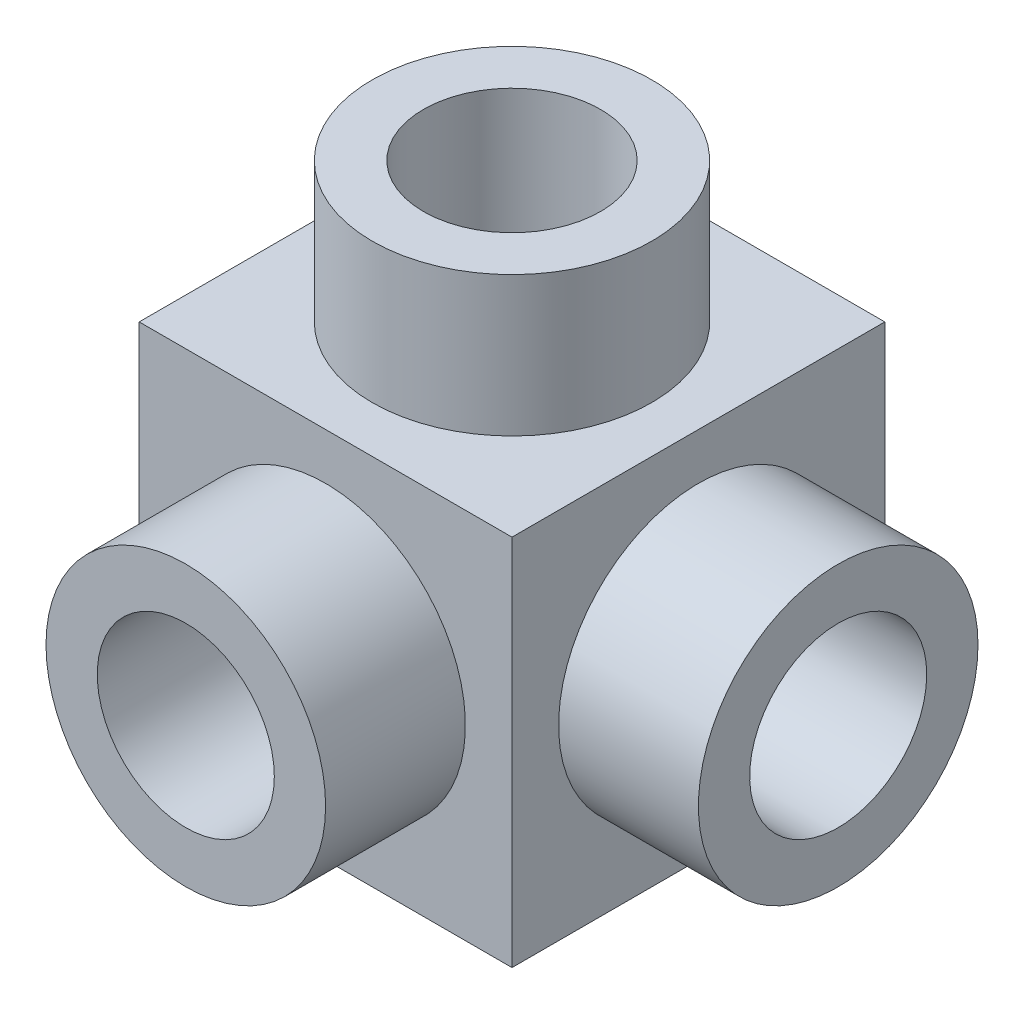
ISO-10303-21;
HEADER;
FILE_DESCRIPTION(('STEP AP214'),'2;1');
FILE_NAME('part.step','',(''),(''),'','','');
FILE_SCHEMA(('AUTOMOTIVE_DESIGN { 1 0 10303 214 1 1 1 1 }'));
ENDSEC;
DATA;
#1=APPLICATION_CONTEXT('core data for automotive mechanical design processes');
#2=APPLICATION_PROTOCOL_DEFINITION('international standard','automotive_design',2000,#1);
#3=PRODUCT_CONTEXT('',#1,'mechanical');
#4=PRODUCT('Part','Part','',(#3));
#5=PRODUCT_RELATED_PRODUCT_CATEGORY('part','',(#4));
#6=PRODUCT_DEFINITION_FORMATION('','',#4);
#7=PRODUCT_DEFINITION_CONTEXT('part definition',#1,'design');
#8=PRODUCT_DEFINITION('design','',#6,#7);
#9=PRODUCT_DEFINITION_SHAPE('','',#8);
#10=(LENGTH_UNIT() NAMED_UNIT(*) SI_UNIT(.MILLI.,.METRE.));
#11=(NAMED_UNIT(*) PLANE_ANGLE_UNIT() SI_UNIT($,.RADIAN.));
#12=(NAMED_UNIT(*) SI_UNIT($,.STERADIAN.) SOLID_ANGLE_UNIT());
#13=UNCERTAINTY_MEASURE_WITH_UNIT(LENGTH_MEASURE(1.E-05),#10,'distance_accuracy_value','');
#14=(GEOMETRIC_REPRESENTATION_CONTEXT(3) GLOBAL_UNCERTAINTY_ASSIGNED_CONTEXT((#13)) GLOBAL_UNIT_ASSIGNED_CONTEXT((#10,
#11,#12)) REPRESENTATION_CONTEXT('',''));
#15=CARTESIAN_POINT('',(0.,0.,0.));
#16=DIRECTION('',(0.,0.,1.));
#17=DIRECTION('',(1.,0.,0.));
#18=AXIS2_PLACEMENT_3D('',#15,#16,#17);
#19=CARTESIAN_POINT('',(0.,0.,30.));
#20=DIRECTION('',(0.,0.,1.));
#21=DIRECTION('',(1.,0.,0.));
#22=AXIS2_PLACEMENT_3D('',#19,#20,#21);
#23=PLANE('',#22);
#24=CARTESIAN_POINT('',(0.,0.,30.));
#25=DIRECTION('',(0.,0.,1.));
#26=DIRECTION('',(1.,0.,0.));
#27=AXIS2_PLACEMENT_3D('',#24,#25,#26);
#28=CIRCLE('',#27,30.);
#29=CARTESIAN_POINT('',(30.,0.,30.));
#30=VERTEX_POINT('',#29);
#31=EDGE_CURVE('E125',#30,#30,#28,.T.);
#32=ORIENTED_EDGE('',*,*,#31,.T.);
#33=EDGE_LOOP('',(#32));
#34=FACE_BOUND('',#33,.T.);
#35=CARTESIAN_POINT('',(0.,0.,30.));
#36=DIRECTION('',(0.,0.,1.));
#37=DIRECTION('',(1.,0.,0.));
#38=AXIS2_PLACEMENT_3D('',#35,#36,#37);
#39=CIRCLE('',#38,19.);
#40=CARTESIAN_POINT('',(19.,0.,30.));
#41=VERTEX_POINT('',#40);
#42=EDGE_CURVE('E122',#41,#41,#39,.T.);
#43=ORIENTED_EDGE('',*,*,#42,.F.);
#44=EDGE_LOOP('',(#43));
#45=FACE_BOUND('',#44,.T.);
#46=ADVANCED_FACE('F37',(#34,#45),#23,.T.);
#47=CARTESIAN_POINT('',(0.,0.,30.));
#48=DIRECTION('',(0.,0.,-1.));
#49=DIRECTION('',(-1.,0.,0.));
#50=AXIS2_PLACEMENT_3D('',#47,#48,#49);
#51=CYLINDRICAL_SURFACE('',#50,30.);
#52=ORIENTED_EDGE('',*,*,#31,.F.);
#53=EDGE_LOOP('',(#52));
#54=FACE_BOUND('',#53,.T.);
#55=CARTESIAN_POINT('',(0.,0.,0.));
#56=DIRECTION('',(0.,0.,-1.));
#57=DIRECTION('',(-1.,0.,0.));
#58=AXIS2_PLACEMENT_3D('',#55,#56,#57);
#59=CIRCLE('',#58,30.);
#60=CARTESIAN_POINT('',(-30.,0.,0.));
#61=VERTEX_POINT('',#60);
#62=EDGE_CURVE('E116',#61,#61,#59,.T.);
#63=ORIENTED_EDGE('',*,*,#62,.F.);
#64=EDGE_LOOP('',(#63));
#65=FACE_BOUND('',#64,.T.);
#66=ADVANCED_FACE('F39',(#54,#65),#51,.T.);
#67=CARTESIAN_POINT('',(0.,0.,30.));
#68=DIRECTION('',(0.,0.,-1.));
#69=DIRECTION('',(-1.,0.,0.));
#70=AXIS2_PLACEMENT_3D('',#67,#68,#69);
#71=CYLINDRICAL_SURFACE('',#70,19.);
#72=ORIENTED_EDGE('',*,*,#42,.T.);
#73=EDGE_LOOP('',(#72));
#74=FACE_BOUND('',#73,.T.);
#75=CARTESIAN_POINT('',(0.,0.,0.));
#76=DIRECTION('',(0.,0.,1.));
#77=DIRECTION('',(1.,0.,0.));
#78=AXIS2_PLACEMENT_3D('',#75,#76,#77);
#79=CIRCLE('',#78,19.);
#80=CARTESIAN_POINT('',(19.,0.,0.));
#81=VERTEX_POINT('',#80);
#82=EDGE_CURVE('E121',#81,#81,#79,.T.);
#83=ORIENTED_EDGE('',*,*,#82,.F.);
#84=EDGE_LOOP('',(#83));
#85=FACE_BOUND('',#84,.T.);
#86=ADVANCED_FACE('F158',(#74,#85),#71,.F.);
#87=CARTESIAN_POINT('',(0.,0.,0.));
#88=DIRECTION('',(0.,0.,-1.));
#89=DIRECTION('',(-1.,0.,0.));
#90=AXIS2_PLACEMENT_3D('',#87,#88,#89);
#91=PLANE('',#90);
#92=ORIENTED_EDGE('',*,*,#82,.T.);
#93=EDGE_LOOP('',(#92));
#94=FACE_BOUND('',#93,.T.);
#95=ADVANCED_FACE('F164',(#94),#91,.F.);
#96=CARTESIAN_POINT('',(-40.,40.,-80.));
#97=DIRECTION('',(-1.,0.,0.));
#98=DIRECTION('',(0.,0.,1.));
#99=AXIS2_PLACEMENT_3D('',#96,#97,#98);
#100=PLANE('',#99);
#101=DIRECTION('',(0.,-1.,0.));
#102=VECTOR('',#101,1.);
#103=CARTESIAN_POINT('',(-40.,40.,0.));
#104=LINE('',#103,#102);
#105=CARTESIAN_POINT('',(-40.,40.,0.));
#106=VERTEX_POINT('',#105);
#107=CARTESIAN_POINT('',(-40.,-40.,0.));
#108=VERTEX_POINT('',#107);
#109=EDGE_CURVE('E106',#106,#108,#104,.T.);
#110=ORIENTED_EDGE('',*,*,#109,.F.);
#111=DIRECTION('',(0.,0.,1.));
#112=VECTOR('',#111,1.);
#113=CARTESIAN_POINT('',(-40.,40.,-80.));
#114=LINE('',#113,#112);
#115=CARTESIAN_POINT('',(-40.,40.,-80.));
#116=VERTEX_POINT('',#115);
#117=EDGE_CURVE('E54',#116,#106,#114,.T.);
#118=ORIENTED_EDGE('',*,*,#117,.F.);
#119=DIRECTION('',(0.,-1.,0.));
#120=VECTOR('',#119,1.);
#121=CARTESIAN_POINT('',(-40.,40.,-80.));
#122=LINE('',#121,#120);
#123=CARTESIAN_POINT('',(-40.,-40.,-80.));
#124=VERTEX_POINT('',#123);
#125=EDGE_CURVE('E99',#116,#124,#122,.T.);
#126=ORIENTED_EDGE('',*,*,#125,.T.);
#127=DIRECTION('',(0.,0.,1.));
#128=VECTOR('',#127,1.);
#129=CARTESIAN_POINT('',(-40.,-40.,-80.));
#130=LINE('',#129,#128);
#131=EDGE_CURVE('E82',#124,#108,#130,.T.);
#132=ORIENTED_EDGE('',*,*,#131,.T.);
#133=EDGE_LOOP('',(#110,#118,#126,#132));
#134=FACE_BOUND('',#133,.T.);
#135=ADVANCED_FACE('F166',(#134),#100,.T.);
#136=CARTESIAN_POINT('',(40.,40.,-80.));
#137=DIRECTION('',(0.,1.,0.));
#138=DIRECTION('',(0.,0.,1.));
#139=AXIS2_PLACEMENT_3D('',#136,#137,#138);
#140=PLANE('',#139);
#141=CARTESIAN_POINT('',(0.,40.,-40.));
#142=DIRECTION('',(0.,1.,0.));
#143=DIRECTION('',(0.,0.,1.));
#144=AXIS2_PLACEMENT_3D('',#141,#142,#143);
#145=CIRCLE('',#144,30.);
#146=CARTESIAN_POINT('',(0.,40.,-10.));
#147=VERTEX_POINT('',#146);
#148=EDGE_CURVE('E221',#147,#147,#145,.T.);
#149=ORIENTED_EDGE('',*,*,#148,.F.);
#150=EDGE_LOOP('',(#149));
#151=FACE_BOUND('',#150,.T.);
#152=DIRECTION('',(-1.,0.,0.));
#153=VECTOR('',#152,1.);
#154=CARTESIAN_POINT('',(40.,40.,0.));
#155=LINE('',#154,#153);
#156=CARTESIAN_POINT('',(40.,40.,0.));
#157=VERTEX_POINT('',#156);
#158=EDGE_CURVE('E101',#157,#106,#155,.T.);
#159=ORIENTED_EDGE('',*,*,#158,.F.);
#160=DIRECTION('',(0.,0.,1.));
#161=VECTOR('',#160,1.);
#162=CARTESIAN_POINT('',(40.,40.,-80.));
#163=LINE('',#162,#161);
#164=CARTESIAN_POINT('',(40.,40.,-80.));
#165=VERTEX_POINT('',#164);
#166=EDGE_CURVE('E71',#165,#157,#163,.T.);
#167=ORIENTED_EDGE('',*,*,#166,.F.);
#168=DIRECTION('',(-1.,0.,0.));
#169=VECTOR('',#168,1.);
#170=CARTESIAN_POINT('',(40.,40.,-80.));
#171=LINE('',#170,#169);
#172=EDGE_CURVE('E96',#165,#116,#171,.T.);
#173=ORIENTED_EDGE('',*,*,#172,.T.);
#174=ORIENTED_EDGE('',*,*,#117,.T.);
#175=EDGE_LOOP('',(#159,#167,#173,#174));
#176=FACE_BOUND('',#175,.T.);
#177=ADVANCED_FACE('F151',(#151,#176),#140,.T.);
#178=CARTESIAN_POINT('',(40.,40.,-80.));
#179=DIRECTION('',(1.,0.,0.));
#180=DIRECTION('',(0.,1.,0.));
#181=AXIS2_PLACEMENT_3D('',#178,#179,#180);
#182=PLANE('',#181);
#183=CARTESIAN_POINT('',(40.,0.,-40.));
#184=DIRECTION('',(1.,0.,0.));
#185=DIRECTION('',(0.,0.,-1.));
#186=AXIS2_PLACEMENT_3D('',#183,#184,#185);
#187=CIRCLE('',#186,30.);
#188=CARTESIAN_POINT('',(40.,0.,-70.));
#189=VERTEX_POINT('',#188);
#190=EDGE_CURVE('E216',#189,#189,#187,.T.);
#191=ORIENTED_EDGE('',*,*,#190,.F.);
#192=EDGE_LOOP('',(#191));
#193=FACE_BOUND('',#192,.T.);
#194=DIRECTION('',(0.,1.,0.));
#195=VECTOR('',#194,1.);
#196=CARTESIAN_POINT('',(40.,40.,0.));
#197=LINE('',#196,#195);
#198=CARTESIAN_POINT('',(40.,-40.,0.));
#199=VERTEX_POINT('',#198);
#200=EDGE_CURVE('E90',#199,#157,#197,.T.);
#201=ORIENTED_EDGE('',*,*,#200,.F.);
#202=DIRECTION('',(0.,0.,1.));
#203=VECTOR('',#202,1.);
#204=CARTESIAN_POINT('',(40.,-40.,-80.));
#205=LINE('',#204,#203);
#206=CARTESIAN_POINT('',(40.,-40.,-80.));
#207=VERTEX_POINT('',#206);
#208=EDGE_CURVE('E85',#207,#199,#205,.T.);
#209=ORIENTED_EDGE('',*,*,#208,.F.);
#210=DIRECTION('',(0.,1.,0.));
#211=VECTOR('',#210,1.);
#212=CARTESIAN_POINT('',(40.,40.,-80.));
#213=LINE('',#212,#211);
#214=EDGE_CURVE('E88',#207,#165,#213,.T.);
#215=ORIENTED_EDGE('',*,*,#214,.T.);
#216=ORIENTED_EDGE('',*,*,#166,.T.);
#217=EDGE_LOOP('',(#201,#209,#215,#216));
#218=FACE_BOUND('',#217,.T.);
#219=ADVANCED_FACE('F87',(#193,#218),#182,.T.);
#220=CARTESIAN_POINT('',(40.,-40.,-80.));
#221=DIRECTION('',(0.,-1.,0.));
#222=DIRECTION('',(0.,0.,-1.));
#223=AXIS2_PLACEMENT_3D('',#220,#221,#222);
#224=PLANE('',#223);
#225=DIRECTION('',(1.,0.,0.));
#226=VECTOR('',#225,1.);
#227=CARTESIAN_POINT('',(40.,-40.,0.));
#228=LINE('',#227,#226);
#229=EDGE_CURVE('E109',#108,#199,#228,.T.);
#230=ORIENTED_EDGE('',*,*,#229,.F.);
#231=ORIENTED_EDGE('',*,*,#131,.F.);
#232=DIRECTION('',(1.,0.,0.));
#233=VECTOR('',#232,1.);
#234=CARTESIAN_POINT('',(40.,-40.,-80.));
#235=LINE('',#234,#233);
#236=EDGE_CURVE('E95',#124,#207,#235,.T.);
#237=ORIENTED_EDGE('',*,*,#236,.T.);
#238=ORIENTED_EDGE('',*,*,#208,.T.);
#239=EDGE_LOOP('',(#230,#231,#237,#238));
#240=FACE_BOUND('',#239,.T.);
#241=ADVANCED_FACE('F98',(#240),#224,.T.);
#242=CARTESIAN_POINT('',(0.,0.,-80.));
#243=DIRECTION('',(0.,0.,-1.));
#244=DIRECTION('',(-1.,0.,0.));
#245=AXIS2_PLACEMENT_3D('',#242,#243,#244);
#246=PLANE('',#245);
#247=ORIENTED_EDGE('',*,*,#125,.F.);
#248=ORIENTED_EDGE('',*,*,#172,.F.);
#249=ORIENTED_EDGE('',*,*,#214,.F.);
#250=ORIENTED_EDGE('',*,*,#236,.F.);
#251=EDGE_LOOP('',(#247,#248,#249,#250));
#252=FACE_BOUND('',#251,.T.);
#253=ADVANCED_FACE('F94',(#252),#246,.T.);
#254=ORIENTED_EDGE('',*,*,#62,.T.);
#255=EDGE_LOOP('',(#254));
#256=FACE_BOUND('',#255,.T.);
#257=ORIENTED_EDGE('',*,*,#109,.T.);
#258=ORIENTED_EDGE('',*,*,#229,.T.);
#259=ORIENTED_EDGE('',*,*,#200,.T.);
#260=ORIENTED_EDGE('',*,*,#158,.T.);
#261=EDGE_LOOP('',(#257,#258,#259,#260));
#262=FACE_BOUND('',#261,.T.);
#263=ADVANCED_FACE('F172',(#256,#262),#91,.F.);
#264=CARTESIAN_POINT('',(70.,0.,-40.));
#265=DIRECTION('',(1.,0.,0.));
#266=DIRECTION('',(0.,0.,-1.));
#267=AXIS2_PLACEMENT_3D('',#264,#265,#266);
#268=PLANE('',#267);
#269=CARTESIAN_POINT('',(70.,0.,-40.));
#270=DIRECTION('',(1.,0.,0.));
#271=DIRECTION('',(0.,0.,-1.));
#272=AXIS2_PLACEMENT_3D('',#269,#270,#271);
#273=CIRCLE('',#272,30.);
#274=CARTESIAN_POINT('',(70.,0.,-70.));
#275=VERTEX_POINT('',#274);
#276=EDGE_CURVE('E110',#275,#275,#273,.T.);
#277=ORIENTED_EDGE('',*,*,#276,.T.);
#278=EDGE_LOOP('',(#277));
#279=FACE_BOUND('',#278,.T.);
#280=CARTESIAN_POINT('',(70.,0.,-40.));
#281=DIRECTION('',(1.,0.,0.));
#282=DIRECTION('',(0.,0.,-1.));
#283=AXIS2_PLACEMENT_3D('',#280,#281,#282);
#284=CIRCLE('',#283,19.);
#285=CARTESIAN_POINT('',(70.,0.,-59.));
#286=VERTEX_POINT('',#285);
#287=EDGE_CURVE('E215',#286,#286,#284,.T.);
#288=ORIENTED_EDGE('',*,*,#287,.F.);
#289=EDGE_LOOP('',(#288));
#290=FACE_BOUND('',#289,.T.);
#291=ADVANCED_FACE('F177',(#279,#290),#268,.T.);
#292=CARTESIAN_POINT('',(70.,0.,-40.));
#293=DIRECTION('',(-1.,0.,0.));
#294=DIRECTION('',(0.,0.,1.));
#295=AXIS2_PLACEMENT_3D('',#292,#293,#294);
#296=CYLINDRICAL_SURFACE('',#295,30.);
#297=ORIENTED_EDGE('',*,*,#276,.F.);
#298=EDGE_LOOP('',(#297));
#299=FACE_BOUND('',#298,.T.);
#300=ORIENTED_EDGE('',*,*,#190,.T.);
#301=EDGE_LOOP('',(#300));
#302=FACE_BOUND('',#301,.T.);
#303=ADVANCED_FACE('F145',(#299,#302),#296,.T.);
#304=CARTESIAN_POINT('',(70.,0.,-40.));
#305=DIRECTION('',(-1.,0.,0.));
#306=DIRECTION('',(0.,0.,1.));
#307=AXIS2_PLACEMENT_3D('',#304,#305,#306);
#308=CYLINDRICAL_SURFACE('',#307,19.);
#309=ORIENTED_EDGE('',*,*,#287,.T.);
#310=EDGE_LOOP('',(#309));
#311=FACE_BOUND('',#310,.T.);
#312=CARTESIAN_POINT('',(40.,0.,-40.));
#313=DIRECTION('',(1.,0.,0.));
#314=DIRECTION('',(0.,1.,0.));
#315=AXIS2_PLACEMENT_3D('',#312,#313,#314);
#316=CIRCLE('',#315,19.);
#317=CARTESIAN_POINT('',(40.,19.,-40.));
#318=VERTEX_POINT('',#317);
#319=EDGE_CURVE('E46',#318,#318,#316,.F.);
#320=ORIENTED_EDGE('',*,*,#319,.T.);
#321=EDGE_LOOP('',(#320));
#322=FACE_BOUND('',#321,.T.);
#323=ADVANCED_FACE('F132',(#311,#322),#308,.F.);
#324=ORIENTED_EDGE('',*,*,#319,.F.);
#325=EDGE_LOOP('',(#324));
#326=FACE_BOUND('',#325,.T.);
#327=ADVANCED_FACE('F134',(#326),#182,.T.);
#328=CARTESIAN_POINT('',(0.,70.,-40.));
#329=DIRECTION('',(0.,1.,0.));
#330=DIRECTION('',(0.,0.,1.));
#331=AXIS2_PLACEMENT_3D('',#328,#329,#330);
#332=PLANE('',#331);
#333=CARTESIAN_POINT('',(0.,70.,-40.));
#334=DIRECTION('',(0.,1.,0.));
#335=DIRECTION('',(0.,0.,1.));
#336=AXIS2_PLACEMENT_3D('',#333,#334,#335);
#337=CIRCLE('',#336,30.);
#338=CARTESIAN_POINT('',(0.,70.,-10.));
#339=VERTEX_POINT('',#338);
#340=EDGE_CURVE('E217',#339,#339,#337,.T.);
#341=ORIENTED_EDGE('',*,*,#340,.T.);
#342=EDGE_LOOP('',(#341));
#343=FACE_BOUND('',#342,.T.);
#344=CARTESIAN_POINT('',(0.,70.,-40.));
#345=DIRECTION('',(0.,1.,0.));
#346=DIRECTION('',(0.,0.,1.));
#347=AXIS2_PLACEMENT_3D('',#344,#345,#346);
#348=CIRCLE('',#347,19.);
#349=CARTESIAN_POINT('',(0.,70.,-21.));
#350=VERTEX_POINT('',#349);
#351=EDGE_CURVE('E226',#350,#350,#348,.T.);
#352=ORIENTED_EDGE('',*,*,#351,.F.);
#353=EDGE_LOOP('',(#352));
#354=FACE_BOUND('',#353,.T.);
#355=ADVANCED_FACE('F136',(#343,#354),#332,.T.);
#356=CARTESIAN_POINT('',(0.,70.,-40.));
#357=DIRECTION('',(0.,-1.,0.));
#358=DIRECTION('',(0.,0.,-1.));
#359=AXIS2_PLACEMENT_3D('',#356,#357,#358);
#360=CYLINDRICAL_SURFACE('',#359,30.);
#361=ORIENTED_EDGE('',*,*,#340,.F.);
#362=EDGE_LOOP('',(#361));
#363=FACE_BOUND('',#362,.T.);
#364=ORIENTED_EDGE('',*,*,#148,.T.);
#365=EDGE_LOOP('',(#364));
#366=FACE_BOUND('',#365,.T.);
#367=ADVANCED_FACE('F142',(#363,#366),#360,.T.);
#368=CARTESIAN_POINT('',(0.,70.,-40.));
#369=DIRECTION('',(0.,-1.,0.));
#370=DIRECTION('',(0.,0.,-1.));
#371=AXIS2_PLACEMENT_3D('',#368,#369,#370);
#372=CYLINDRICAL_SURFACE('',#371,19.);
#373=ORIENTED_EDGE('',*,*,#351,.T.);
#374=EDGE_LOOP('',(#373));
#375=FACE_BOUND('',#374,.T.);
#376=CARTESIAN_POINT('',(0.,40.,-40.));
#377=DIRECTION('',(0.,1.,0.));
#378=DIRECTION('',(0.,0.,1.));
#379=AXIS2_PLACEMENT_3D('',#376,#377,#378);
#380=CIRCLE('',#379,19.);
#381=CARTESIAN_POINT('',(0.,40.,-21.));
#382=VERTEX_POINT('',#381);
#383=EDGE_CURVE('E11',#382,#382,#380,.F.);
#384=ORIENTED_EDGE('',*,*,#383,.T.);
#385=EDGE_LOOP('',(#384));
#386=FACE_BOUND('',#385,.T.);
#387=ADVANCED_FACE('F189',(#375,#386),#372,.F.);
#388=ORIENTED_EDGE('',*,*,#383,.F.);
#389=EDGE_LOOP('',(#388));
#390=FACE_BOUND('',#389,.T.);
#391=ADVANCED_FACE('F184',(#390),#140,.T.);
#392=CLOSED_SHELL('',(#46,#66,#86,#95,#135,#177,#219,#241,#253,#263,#291,#303,#323,#327,#355,
#367,#387,#391));
#393=MANIFOLD_SOLID_BREP('B2',#392);
#394=ADVANCED_BREP_SHAPE_REPRESENTATION('',(#18,#393),#14);
#395=SHAPE_DEFINITION_REPRESENTATION(#9,#394);
ENDSEC;
END-ISO-10303-21;
